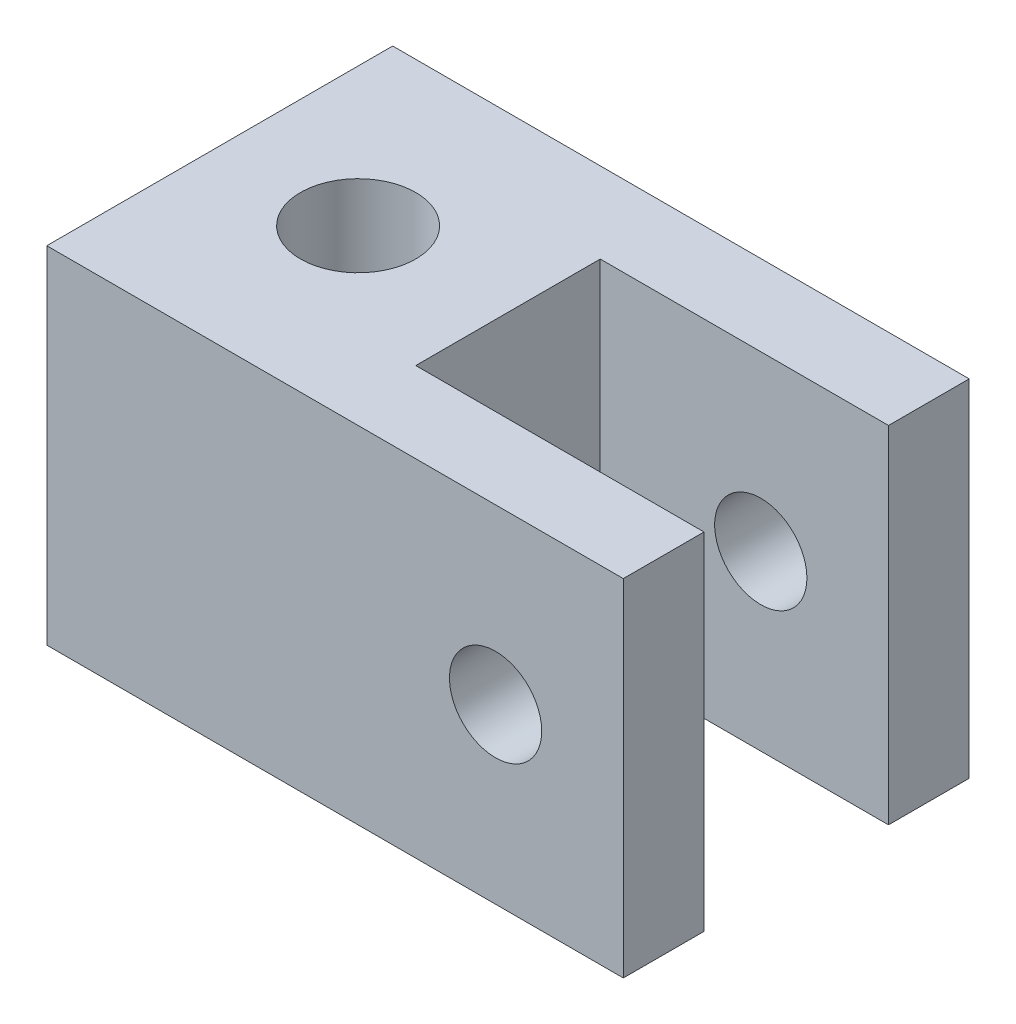
ISO-10303-21;
HEADER;
FILE_DESCRIPTION(('STEP AP214'),'2;1');
FILE_NAME('part.step','',(''),(''),'','','');
FILE_SCHEMA(('AUTOMOTIVE_DESIGN { 1 0 10303 214 1 1 1 1 }'));
ENDSEC;
DATA;
#1=APPLICATION_CONTEXT('core data for automotive mechanical design processes');
#2=APPLICATION_PROTOCOL_DEFINITION('international standard','automotive_design',2000,#1);
#3=PRODUCT_CONTEXT('',#1,'mechanical');
#4=PRODUCT('Part','Part','',(#3));
#5=PRODUCT_RELATED_PRODUCT_CATEGORY('part','',(#4));
#6=PRODUCT_DEFINITION_FORMATION('','',#4);
#7=PRODUCT_DEFINITION_CONTEXT('part definition',#1,'design');
#8=PRODUCT_DEFINITION('design','',#6,#7);
#9=PRODUCT_DEFINITION_SHAPE('','',#8);
#10=(LENGTH_UNIT() NAMED_UNIT(*) SI_UNIT(.MILLI.,.METRE.));
#11=(NAMED_UNIT(*) PLANE_ANGLE_UNIT() SI_UNIT($,.RADIAN.));
#12=(NAMED_UNIT(*) SI_UNIT($,.STERADIAN.) SOLID_ANGLE_UNIT());
#13=UNCERTAINTY_MEASURE_WITH_UNIT(LENGTH_MEASURE(1.E-05),#10,'distance_accuracy_value','');
#14=(GEOMETRIC_REPRESENTATION_CONTEXT(3) GLOBAL_UNCERTAINTY_ASSIGNED_CONTEXT((#13)) GLOBAL_UNIT_ASSIGNED_CONTEXT((#10,
#11,#12)) REPRESENTATION_CONTEXT('',''));
#15=CARTESIAN_POINT('',(0.,0.,0.));
#16=DIRECTION('',(0.,0.,1.));
#17=DIRECTION('',(1.,0.,0.));
#18=AXIS2_PLACEMENT_3D('',#15,#16,#17);
#19=CARTESIAN_POINT('',(12.5,0.,0.));
#20=DIRECTION('',(1.,0.,0.));
#21=DIRECTION('',(0.,0.,-1.));
#22=AXIS2_PLACEMENT_3D('',#19,#20,#21);
#23=PLANE('',#22);
#24=DIRECTION('',(0.,-1.,0.));
#25=VECTOR('',#24,1.);
#26=CARTESIAN_POINT('',(12.5,0.,4.));
#27=LINE('',#26,#25);
#28=CARTESIAN_POINT('',(12.5,7.5,4.));
#29=VERTEX_POINT('',#28);
#30=CARTESIAN_POINT('',(12.5,-7.50000000000001,4.));
#31=VERTEX_POINT('',#30);
#32=EDGE_CURVE('E11',#29,#31,#27,.T.);
#33=ORIENTED_EDGE('',*,*,#32,.F.);
#34=DIRECTION('',(0.,0.,1.));
#35=VECTOR('',#34,1.);
#36=CARTESIAN_POINT('',(12.5,7.5,-7.5));
#37=LINE('',#36,#35);
#38=CARTESIAN_POINT('',(12.5,7.5,7.5));
#39=VERTEX_POINT('',#38);
#40=EDGE_CURVE('E58',#29,#39,#37,.T.);
#41=ORIENTED_EDGE('',*,*,#40,.T.);
#42=DIRECTION('',(0.,-1.,0.));
#43=VECTOR('',#42,1.);
#44=CARTESIAN_POINT('',(12.5,-7.5,7.5));
#45=LINE('',#44,#43);
#46=CARTESIAN_POINT('',(12.5,-7.5,7.5));
#47=VERTEX_POINT('',#46);
#48=EDGE_CURVE('E147',#39,#47,#45,.T.);
#49=ORIENTED_EDGE('',*,*,#48,.T.);
#50=DIRECTION('',(0.,0.,-1.));
#51=VECTOR('',#50,1.);
#52=CARTESIAN_POINT('',(12.5,-7.5,-7.5));
#53=LINE('',#52,#51);
#54=EDGE_CURVE('E88',#47,#31,#53,.T.);
#55=ORIENTED_EDGE('',*,*,#54,.T.);
#56=EDGE_LOOP('',(#33,#41,#49,#55));
#57=FACE_BOUND('',#56,.T.);
#58=ADVANCED_FACE('F33',(#57),#23,.T.);
#59=CARTESIAN_POINT('',(12.5,-7.5,7.5));
#60=DIRECTION('',(0.,0.,-1.));
#61=DIRECTION('',(0.,1.,0.));
#62=AXIS2_PLACEMENT_3D('',#59,#60,#61);
#63=PLANE('',#62);
#64=CARTESIAN_POINT('',(6.96154908193102,0.,7.5));
#65=DIRECTION('',(0.,0.,1.));
#66=DIRECTION('',(1.,0.,0.));
#67=AXIS2_PLACEMENT_3D('',#64,#65,#66);
#68=CIRCLE('',#67,2.);
#69=CARTESIAN_POINT('',(8.96154908193102,0.,7.5));
#70=VERTEX_POINT('',#69);
#71=EDGE_CURVE('E241',#70,#70,#68,.T.);
#72=ORIENTED_EDGE('',*,*,#71,.F.);
#73=EDGE_LOOP('',(#72));
#74=FACE_BOUND('',#73,.T.);
#75=DIRECTION('',(0.,-1.,0.));
#76=VECTOR('',#75,1.);
#77=CARTESIAN_POINT('',(-12.5,-7.5,7.5));
#78=LINE('',#77,#76);
#79=CARTESIAN_POINT('',(-12.5,7.5,7.5));
#80=VERTEX_POINT('',#79);
#81=CARTESIAN_POINT('',(-12.5,-7.5,7.5));
#82=VERTEX_POINT('',#81);
#83=EDGE_CURVE('E144',#80,#82,#78,.T.);
#84=ORIENTED_EDGE('',*,*,#83,.T.);
#85=DIRECTION('',(-1.,0.,0.));
#86=VECTOR('',#85,1.);
#87=CARTESIAN_POINT('',(12.5,-7.5,7.5));
#88=LINE('',#87,#86);
#89=EDGE_CURVE('E169',#47,#82,#88,.T.);
#90=ORIENTED_EDGE('',*,*,#89,.F.);
#91=ORIENTED_EDGE('',*,*,#48,.F.);
#92=DIRECTION('',(-1.,0.,0.));
#93=VECTOR('',#92,1.);
#94=CARTESIAN_POINT('',(12.5,7.5,7.5));
#95=LINE('',#94,#93);
#96=EDGE_CURVE('E155',#39,#80,#95,.T.);
#97=ORIENTED_EDGE('',*,*,#96,.T.);
#98=EDGE_LOOP('',(#84,#90,#91,#97));
#99=FACE_BOUND('',#98,.T.);
#100=ADVANCED_FACE('F35',(#74,#99),#63,.F.);
#101=CARTESIAN_POINT('',(12.5,-7.5,-7.5));
#102=DIRECTION('',(0.,1.,0.));
#103=DIRECTION('',(0.,0.,1.));
#104=AXIS2_PLACEMENT_3D('',#101,#102,#103);
#105=PLANE('',#104);
#106=CARTESIAN_POINT('',(-6.5,-7.50000000000001,0.));
#107=DIRECTION('',(0.,1.,0.));
#108=DIRECTION('',(0.,0.,1.));
#109=AXIS2_PLACEMENT_3D('',#106,#107,#108);
#110=CIRCLE('',#109,2.5);
#111=CARTESIAN_POINT('',(-6.5,-7.50000000000001,2.5));
#112=VERTEX_POINT('',#111);
#113=EDGE_CURVE('E141',#112,#112,#110,.T.);
#114=ORIENTED_EDGE('',*,*,#113,.T.);
#115=EDGE_LOOP('',(#114));
#116=FACE_BOUND('',#115,.T.);
#117=DIRECTION('',(0.,0.,1.));
#118=VECTOR('',#117,1.);
#119=CARTESIAN_POINT('',(0.,-7.50000000000001,4.));
#120=LINE('',#119,#118);
#121=CARTESIAN_POINT('',(0.,-7.50000000000001,-4.));
#122=VERTEX_POINT('',#121);
#123=CARTESIAN_POINT('',(0.,-7.50000000000001,4.));
#124=VERTEX_POINT('',#123);
#125=EDGE_CURVE('E120',#122,#124,#120,.T.);
#126=ORIENTED_EDGE('',*,*,#125,.T.);
#127=DIRECTION('',(1.,0.,0.));
#128=VECTOR('',#127,1.);
#129=CARTESIAN_POINT('',(0.,-7.50000000000001,4.));
#130=LINE('',#129,#128);
#131=EDGE_CURVE('E117',#124,#31,#130,.T.);
#132=ORIENTED_EDGE('',*,*,#131,.T.);
#133=ORIENTED_EDGE('',*,*,#54,.F.);
#134=ORIENTED_EDGE('',*,*,#89,.T.);
#135=DIRECTION('',(0.,0.,-1.));
#136=VECTOR('',#135,1.);
#137=CARTESIAN_POINT('',(-12.5,-7.5,-7.5));
#138=LINE('',#137,#136);
#139=CARTESIAN_POINT('',(-12.5,-7.5,-7.5));
#140=VERTEX_POINT('',#139);
#141=EDGE_CURVE('E158',#82,#140,#138,.T.);
#142=ORIENTED_EDGE('',*,*,#141,.T.);
#143=DIRECTION('',(-1.,0.,0.));
#144=VECTOR('',#143,1.);
#145=CARTESIAN_POINT('',(12.5,-7.5,-7.5));
#146=LINE('',#145,#144);
#147=CARTESIAN_POINT('',(12.5,-7.5,-7.5));
#148=VERTEX_POINT('',#147);
#149=EDGE_CURVE('E166',#148,#140,#146,.T.);
#150=ORIENTED_EDGE('',*,*,#149,.F.);
#151=CARTESIAN_POINT('',(12.5,-7.5,-4.));
#152=VERTEX_POINT('',#151);
#153=EDGE_CURVE('E127',#152,#148,#53,.T.);
#154=ORIENTED_EDGE('',*,*,#153,.F.);
#155=DIRECTION('',(-1.,0.,0.));
#156=VECTOR('',#155,1.);
#157=CARTESIAN_POINT('',(0.,-7.50000000000001,-4.));
#158=LINE('',#157,#156);
#159=EDGE_CURVE('E49',#152,#122,#158,.T.);
#160=ORIENTED_EDGE('',*,*,#159,.T.);
#161=EDGE_LOOP('',(#126,#132,#133,#134,#142,#150,#154,#160));
#162=FACE_BOUND('',#161,.T.);
#163=ADVANCED_FACE('F125',(#116,#162),#105,.F.);
#164=CARTESIAN_POINT('',(12.5,-7.5,-7.5));
#165=DIRECTION('',(0.,0.,1.));
#166=DIRECTION('',(0.,-1.,0.));
#167=AXIS2_PLACEMENT_3D('',#164,#165,#166);
#168=PLANE('',#167);
#169=CARTESIAN_POINT('',(6.96154908193102,0.,-7.5));
#170=DIRECTION('',(0.,0.,1.));
#171=DIRECTION('',(1.,0.,0.));
#172=AXIS2_PLACEMENT_3D('',#169,#170,#171);
#173=CIRCLE('',#172,2.);
#174=CARTESIAN_POINT('',(8.96154908193102,0.,-7.5));
#175=VERTEX_POINT('',#174);
#176=EDGE_CURVE('E245',#175,#175,#173,.T.);
#177=ORIENTED_EDGE('',*,*,#176,.T.);
#178=EDGE_LOOP('',(#177));
#179=FACE_BOUND('',#178,.T.);
#180=DIRECTION('',(0.,1.,0.));
#181=VECTOR('',#180,1.);
#182=CARTESIAN_POINT('',(-12.5,-7.5,-7.5));
#183=LINE('',#182,#181);
#184=CARTESIAN_POINT('',(-12.5,7.5,-7.5));
#185=VERTEX_POINT('',#184);
#186=EDGE_CURVE('E160',#140,#185,#183,.T.);
#187=ORIENTED_EDGE('',*,*,#186,.T.);
#188=DIRECTION('',(-1.,0.,0.));
#189=VECTOR('',#188,1.);
#190=CARTESIAN_POINT('',(12.5,7.5,-7.5));
#191=LINE('',#190,#189);
#192=CARTESIAN_POINT('',(12.5,7.5,-7.5));
#193=VERTEX_POINT('',#192);
#194=EDGE_CURVE('E164',#193,#185,#191,.T.);
#195=ORIENTED_EDGE('',*,*,#194,.F.);
#196=DIRECTION('',(0.,1.,0.));
#197=VECTOR('',#196,1.);
#198=CARTESIAN_POINT('',(12.5,-7.5,-7.5));
#199=LINE('',#198,#197);
#200=EDGE_CURVE('E150',#148,#193,#199,.T.);
#201=ORIENTED_EDGE('',*,*,#200,.F.);
#202=ORIENTED_EDGE('',*,*,#149,.T.);
#203=EDGE_LOOP('',(#187,#195,#201,#202));
#204=FACE_BOUND('',#203,.T.);
#205=ADVANCED_FACE('F179',(#179,#204),#168,.F.);
#206=CARTESIAN_POINT('',(12.5,7.5,-7.5));
#207=DIRECTION('',(0.,-1.,0.));
#208=DIRECTION('',(0.,0.,-1.));
#209=AXIS2_PLACEMENT_3D('',#206,#207,#208);
#210=PLANE('',#209);
#211=CARTESIAN_POINT('',(-6.5,7.5,0.));
#212=DIRECTION('',(0.,1.,0.));
#213=DIRECTION('',(0.,0.,1.));
#214=AXIS2_PLACEMENT_3D('',#211,#212,#213);
#215=CIRCLE('',#214,2.5);
#216=CARTESIAN_POINT('',(-6.5,7.5,2.5));
#217=VERTEX_POINT('',#216);
#218=EDGE_CURVE('E139',#217,#217,#215,.T.);
#219=ORIENTED_EDGE('',*,*,#218,.F.);
#220=EDGE_LOOP('',(#219));
#221=FACE_BOUND('',#220,.T.);
#222=ORIENTED_EDGE('',*,*,#40,.F.);
#223=DIRECTION('',(1.,0.,0.));
#224=VECTOR('',#223,1.);
#225=CARTESIAN_POINT('',(0.,7.5,4.));
#226=LINE('',#225,#224);
#227=CARTESIAN_POINT('',(0.,7.5,4.));
#228=VERTEX_POINT('',#227);
#229=EDGE_CURVE('E128',#228,#29,#226,.T.);
#230=ORIENTED_EDGE('',*,*,#229,.F.);
#231=DIRECTION('',(0.,0.,1.));
#232=VECTOR('',#231,1.);
#233=CARTESIAN_POINT('',(0.,7.5,4.));
#234=LINE('',#233,#232);
#235=CARTESIAN_POINT('',(0.,7.5,-4.));
#236=VERTEX_POINT('',#235);
#237=EDGE_CURVE('E130',#236,#228,#234,.T.);
#238=ORIENTED_EDGE('',*,*,#237,.F.);
#239=DIRECTION('',(-1.,0.,0.));
#240=VECTOR('',#239,1.);
#241=CARTESIAN_POINT('',(0.,7.5,-4.));
#242=LINE('',#241,#240);
#243=CARTESIAN_POINT('',(12.5,7.5,-4.));
#244=VERTEX_POINT('',#243);
#245=EDGE_CURVE('E112',#244,#236,#242,.T.);
#246=ORIENTED_EDGE('',*,*,#245,.F.);
#247=EDGE_CURVE('E152',#193,#244,#37,.T.);
#248=ORIENTED_EDGE('',*,*,#247,.F.);
#249=ORIENTED_EDGE('',*,*,#194,.T.);
#250=DIRECTION('',(0.,0.,1.));
#251=VECTOR('',#250,1.);
#252=CARTESIAN_POINT('',(-12.5,7.5,-7.5));
#253=LINE('',#252,#251);
#254=EDGE_CURVE('E80',#185,#80,#253,.T.);
#255=ORIENTED_EDGE('',*,*,#254,.T.);
#256=ORIENTED_EDGE('',*,*,#96,.F.);
#257=EDGE_LOOP('',(#222,#230,#238,#246,#248,#249,#255,#256));
#258=FACE_BOUND('',#257,.T.);
#259=ADVANCED_FACE('F173',(#221,#258),#210,.F.);
#260=DIRECTION('',(0.,1.,0.));
#261=VECTOR('',#260,1.);
#262=CARTESIAN_POINT('',(12.5,0.,-4.));
#263=LINE('',#262,#261);
#264=EDGE_CURVE('E42',#152,#244,#263,.T.);
#265=ORIENTED_EDGE('',*,*,#264,.F.);
#266=ORIENTED_EDGE('',*,*,#153,.T.);
#267=ORIENTED_EDGE('',*,*,#200,.T.);
#268=ORIENTED_EDGE('',*,*,#247,.T.);
#269=EDGE_LOOP('',(#265,#266,#267,#268));
#270=FACE_BOUND('',#269,.T.);
#271=ADVANCED_FACE('F175',(#270),#23,.T.);
#272=CARTESIAN_POINT('',(-12.5,0.,0.));
#273=DIRECTION('',(1.,0.,0.));
#274=DIRECTION('',(0.,0.,-1.));
#275=AXIS2_PLACEMENT_3D('',#272,#273,#274);
#276=PLANE('',#275);
#277=ORIENTED_EDGE('',*,*,#83,.F.);
#278=ORIENTED_EDGE('',*,*,#254,.F.);
#279=ORIENTED_EDGE('',*,*,#186,.F.);
#280=ORIENTED_EDGE('',*,*,#141,.F.);
#281=EDGE_LOOP('',(#277,#278,#279,#280));
#282=FACE_BOUND('',#281,.T.);
#283=ADVANCED_FACE('F183',(#282),#276,.F.);
#284=CARTESIAN_POINT('',(-6.5,-7.50000000000001,0.));
#285=DIRECTION('',(0.,1.,0.));
#286=DIRECTION('',(0.,0.,1.));
#287=AXIS2_PLACEMENT_3D('',#284,#285,#286);
#288=CYLINDRICAL_SURFACE('',#287,2.5);
#289=ORIENTED_EDGE('',*,*,#113,.F.);
#290=EDGE_LOOP('',(#289));
#291=FACE_BOUND('',#290,.T.);
#292=ORIENTED_EDGE('',*,*,#218,.T.);
#293=EDGE_LOOP('',(#292));
#294=FACE_BOUND('',#293,.T.);
#295=ADVANCED_FACE('F202',(#291,#294),#288,.F.);
#296=CARTESIAN_POINT('',(0.,-7.50000000000001,4.));
#297=DIRECTION('',(0.,0.,1.));
#298=DIRECTION('',(0.,-1.,0.));
#299=AXIS2_PLACEMENT_3D('',#296,#297,#298);
#300=PLANE('',#299);
#301=CARTESIAN_POINT('',(6.96154908193102,0.,4.));
#302=DIRECTION('',(0.,0.,1.));
#303=DIRECTION('',(0.,-1.,0.));
#304=AXIS2_PLACEMENT_3D('',#301,#302,#303);
#305=CIRCLE('',#304,2.);
#306=CARTESIAN_POINT('',(8.96154908193102,0.,4.));
#307=VERTEX_POINT('',#306);
#308=EDGE_CURVE('E133',#307,#307,#305,.T.);
#309=ORIENTED_EDGE('',*,*,#308,.T.);
#310=EDGE_LOOP('',(#309));
#311=FACE_BOUND('',#310,.T.);
#312=ORIENTED_EDGE('',*,*,#32,.T.);
#313=ORIENTED_EDGE('',*,*,#131,.F.);
#314=DIRECTION('',(0.,1.,0.));
#315=VECTOR('',#314,1.);
#316=CARTESIAN_POINT('',(0.,-7.50000000000001,4.));
#317=LINE('',#316,#315);
#318=EDGE_CURVE('E116',#124,#228,#317,.T.);
#319=ORIENTED_EDGE('',*,*,#318,.T.);
#320=ORIENTED_EDGE('',*,*,#229,.T.);
#321=EDGE_LOOP('',(#312,#313,#319,#320));
#322=FACE_BOUND('',#321,.T.);
#323=ADVANCED_FACE('F188',(#311,#322),#300,.F.);
#324=CARTESIAN_POINT('',(0.,-7.50000000000001,4.));
#325=DIRECTION('',(-1.,0.,0.));
#326=DIRECTION('',(0.,0.,1.));
#327=AXIS2_PLACEMENT_3D('',#324,#325,#326);
#328=PLANE('',#327);
#329=ORIENTED_EDGE('',*,*,#237,.T.);
#330=ORIENTED_EDGE('',*,*,#318,.F.);
#331=ORIENTED_EDGE('',*,*,#125,.F.);
#332=DIRECTION('',(0.,1.,0.));
#333=VECTOR('',#332,1.);
#334=CARTESIAN_POINT('',(0.,-7.50000000000001,-4.));
#335=LINE('',#334,#333);
#336=EDGE_CURVE('E108',#122,#236,#335,.T.);
#337=ORIENTED_EDGE('',*,*,#336,.T.);
#338=EDGE_LOOP('',(#329,#330,#331,#337));
#339=FACE_BOUND('',#338,.T.);
#340=ADVANCED_FACE('F121',(#339),#328,.F.);
#341=CARTESIAN_POINT('',(0.,-7.50000000000001,-4.));
#342=DIRECTION('',(0.,0.,-1.));
#343=DIRECTION('',(0.,1.,0.));
#344=AXIS2_PLACEMENT_3D('',#341,#342,#343);
#345=PLANE('',#344);
#346=CARTESIAN_POINT('',(6.96154908193102,0.,-4.));
#347=DIRECTION('',(0.,0.,-1.));
#348=DIRECTION('',(0.,1.,0.));
#349=AXIS2_PLACEMENT_3D('',#346,#347,#348);
#350=CIRCLE('',#349,2.);
#351=CARTESIAN_POINT('',(8.96154908193102,0.,-4.));
#352=VERTEX_POINT('',#351);
#353=EDGE_CURVE('E37',#352,#352,#350,.T.);
#354=ORIENTED_EDGE('',*,*,#353,.T.);
#355=EDGE_LOOP('',(#354));
#356=FACE_BOUND('',#355,.T.);
#357=ORIENTED_EDGE('',*,*,#264,.T.);
#358=ORIENTED_EDGE('',*,*,#245,.T.);
#359=ORIENTED_EDGE('',*,*,#336,.F.);
#360=ORIENTED_EDGE('',*,*,#159,.F.);
#361=EDGE_LOOP('',(#357,#358,#359,#360));
#362=FACE_BOUND('',#361,.T.);
#363=ADVANCED_FACE('F110',(#356,#362),#345,.F.);
#364=CARTESIAN_POINT('',(6.96154908193102,0.,-7.5));
#365=DIRECTION('',(0.,0.,1.));
#366=DIRECTION('',(1.,0.,0.));
#367=AXIS2_PLACEMENT_3D('',#364,#365,#366);
#368=CYLINDRICAL_SURFACE('',#367,2.);
#369=CARTESIAN_POINT('',(8.96154908193102,0.,-7.5));
#370=CARTESIAN_POINT('',(8.96154908193102,0.,-7.46354166666667));
#371=CARTESIAN_POINT('',(8.96154908193102,0.,-7.42708333333333));
#372=CARTESIAN_POINT('',(8.96154908193102,0.,-7.35416666666667));
#373=CARTESIAN_POINT('',(8.96154908193102,0.,-7.31770833333333));
#374=CARTESIAN_POINT('',(8.96154908193102,0.,-7.24479166666667));
#375=CARTESIAN_POINT('',(8.96154908193102,0.,-7.20833333333333));
#376=CARTESIAN_POINT('',(8.96154908193102,0.,-7.13541666666667));
#377=CARTESIAN_POINT('',(8.96154908193102,0.,-7.09895833333333));
#378=CARTESIAN_POINT('',(8.96154908193102,0.,-7.02604166666667));
#379=CARTESIAN_POINT('',(8.96154908193102,0.,-6.98958333333333));
#380=CARTESIAN_POINT('',(8.96154908193102,0.,-6.91666666666667));
#381=CARTESIAN_POINT('',(8.96154908193102,0.,-6.88020833333333));
#382=CARTESIAN_POINT('',(8.96154908193102,0.,-6.80729166666667));
#383=CARTESIAN_POINT('',(8.96154908193102,0.,-6.77083333333333));
#384=CARTESIAN_POINT('',(8.96154908193102,0.,-6.69791666666667));
#385=CARTESIAN_POINT('',(8.96154908193102,0.,-6.66145833333333));
#386=CARTESIAN_POINT('',(8.96154908193102,0.,-6.58854166666667));
#387=CARTESIAN_POINT('',(8.96154908193102,0.,-6.55208333333333));
#388=CARTESIAN_POINT('',(8.96154908193102,0.,-6.47916666666667));
#389=CARTESIAN_POINT('',(8.96154908193102,0.,-6.44270833333333));
#390=CARTESIAN_POINT('',(8.96154908193102,0.,-6.36979166666667));
#391=CARTESIAN_POINT('',(8.96154908193102,0.,-6.33333333333333));
#392=CARTESIAN_POINT('',(8.96154908193102,0.,-6.26041666666667));
#393=CARTESIAN_POINT('',(8.96154908193102,0.,-6.22395833333333));
#394=CARTESIAN_POINT('',(8.96154908193102,0.,-6.15104166666667));
#395=CARTESIAN_POINT('',(8.96154908193102,0.,-6.11458333333333));
#396=CARTESIAN_POINT('',(8.96154908193102,0.,-6.04166666666667));
#397=CARTESIAN_POINT('',(8.96154908193102,0.,-6.00520833333333));
#398=CARTESIAN_POINT('',(8.96154908193102,0.,-5.93229166666667));
#399=CARTESIAN_POINT('',(8.96154908193102,0.,-5.89583333333333));
#400=CARTESIAN_POINT('',(8.96154908193102,0.,-5.82291666666667));
#401=CARTESIAN_POINT('',(8.96154908193102,0.,-5.78645833333333));
#402=CARTESIAN_POINT('',(8.96154908193102,0.,-5.71354166666667));
#403=CARTESIAN_POINT('',(8.96154908193102,0.,-5.67708333333333));
#404=CARTESIAN_POINT('',(8.96154908193102,0.,-5.60416666666667));
#405=CARTESIAN_POINT('',(8.96154908193102,0.,-5.56770833333333));
#406=CARTESIAN_POINT('',(8.96154908193102,0.,-5.49479166666667));
#407=CARTESIAN_POINT('',(8.96154908193102,0.,-5.45833333333333));
#408=CARTESIAN_POINT('',(8.96154908193102,0.,-5.38541666666667));
#409=CARTESIAN_POINT('',(8.96154908193102,0.,-5.34895833333333));
#410=CARTESIAN_POINT('',(8.96154908193102,0.,-5.27604166666667));
#411=CARTESIAN_POINT('',(8.96154908193102,0.,-5.23958333333333));
#412=CARTESIAN_POINT('',(8.96154908193102,0.,-5.16666666666667));
#413=CARTESIAN_POINT('',(8.96154908193102,0.,-5.13020833333333));
#414=CARTESIAN_POINT('',(8.96154908193102,0.,-5.05729166666667));
#415=CARTESIAN_POINT('',(8.96154908193102,0.,-5.02083333333333));
#416=CARTESIAN_POINT('',(8.96154908193102,0.,-4.94791666666667));
#417=CARTESIAN_POINT('',(8.96154908193102,0.,-4.91145833333333));
#418=CARTESIAN_POINT('',(8.96154908193102,0.,-4.83854166666667));
#419=CARTESIAN_POINT('',(8.96154908193102,0.,-4.80208333333333));
#420=CARTESIAN_POINT('',(8.96154908193102,0.,-4.72916666666667));
#421=CARTESIAN_POINT('',(8.96154908193102,0.,-4.69270833333333));
#422=CARTESIAN_POINT('',(8.96154908193102,0.,-4.61979166666667));
#423=CARTESIAN_POINT('',(8.96154908193102,0.,-4.58333333333333));
#424=CARTESIAN_POINT('',(8.96154908193102,0.,-4.51041666666667));
#425=CARTESIAN_POINT('',(8.96154908193102,0.,-4.47395833333333));
#426=CARTESIAN_POINT('',(8.96154908193102,0.,-4.40104166666667));
#427=CARTESIAN_POINT('',(8.96154908193102,0.,-4.36458333333333));
#428=CARTESIAN_POINT('',(8.96154908193102,0.,-4.29166666666667));
#429=CARTESIAN_POINT('',(8.96154908193102,0.,-4.25520833333333));
#430=CARTESIAN_POINT('',(8.96154908193102,0.,-4.18229166666667));
#431=CARTESIAN_POINT('',(8.96154908193102,0.,-4.14583333333333));
#432=CARTESIAN_POINT('',(8.96154908193102,0.,-4.07291666666667));
#433=CARTESIAN_POINT('',(8.96154908193102,0.,-4.03645833333333));
#434=CARTESIAN_POINT('',(8.96154908193102,0.,-4.));
#435=B_SPLINE_CURVE_WITH_KNOTS('',3,(#369,#370,#371,#372,#373,#374,#375,#376,#377,#378,#379,
#380,#381,#382,#383,#384,#385,#386,#387,#388,#389,#390,#391,#392,#393,#394,#395,#396,#397,#398,
#399,#400,#401,#402,#403,#404,#405,#406,#407,#408,#409,#410,#411,#412,#413,#414,#415,#416,#417,
#418,#419,#420,#421,#422,#423,#424,#425,#426,#427,#428,#429,#430,#431,#432,#433,#434),
.UNSPECIFIED.,.F.,.F.,(4,2,2,2,2,2,2,2,2,2,2,2,2,2,2,2,2,2,2,2,2,2,2,2,2,2,2,2,2,2,2,2,4),(0.,
0.109374999999999,0.218749999999999,0.328124999999999,0.4375,0.546875,0.65625,0.765625,0.875,
0.984374999999999,1.09375,1.203125,1.3125,1.421875,1.53125,1.640625,1.75,1.859375,1.96875,
2.078125,2.1875,2.296875,2.40625,2.515625,2.625,2.734375,2.84375,2.953125,3.0625,3.171875,
3.28125,3.390625,3.5),.UNSPECIFIED.);
#436=EDGE_CURVE('BSEAM227',#175,#352,#435,.T.);
#437=ORIENTED_EDGE('',*,*,#176,.F.);
#438=ORIENTED_EDGE('',*,*,#353,.F.);
#439=ORIENTED_EDGE('',*,*,#436,.T.);
#440=ORIENTED_EDGE('',*,*,#436,.F.);
#441=EDGE_LOOP('',(#437,#439,#438,#440));
#442=FACE_BOUND('',#441,.T.);
#443=ADVANCED_FACE('F227',(#442),#368,.F.);
#444=CARTESIAN_POINT('',(8.96154908193102,0.,7.5));
#445=CARTESIAN_POINT('',(8.96154908193102,0.,7.46354166666667));
#446=CARTESIAN_POINT('',(8.96154908193102,0.,7.42708333333333));
#447=CARTESIAN_POINT('',(8.96154908193102,0.,7.35416666666667));
#448=CARTESIAN_POINT('',(8.96154908193102,0.,7.31770833333333));
#449=CARTESIAN_POINT('',(8.96154908193102,0.,7.24479166666667));
#450=CARTESIAN_POINT('',(8.96154908193102,0.,7.20833333333333));
#451=CARTESIAN_POINT('',(8.96154908193102,0.,7.13541666666667));
#452=CARTESIAN_POINT('',(8.96154908193102,0.,7.09895833333333));
#453=CARTESIAN_POINT('',(8.96154908193102,0.,7.02604166666667));
#454=CARTESIAN_POINT('',(8.96154908193102,0.,6.98958333333333));
#455=CARTESIAN_POINT('',(8.96154908193102,0.,6.91666666666667));
#456=CARTESIAN_POINT('',(8.96154908193102,0.,6.88020833333333));
#457=CARTESIAN_POINT('',(8.96154908193102,0.,6.80729166666667));
#458=CARTESIAN_POINT('',(8.96154908193102,0.,6.77083333333333));
#459=CARTESIAN_POINT('',(8.96154908193102,0.,6.69791666666667));
#460=CARTESIAN_POINT('',(8.96154908193102,0.,6.66145833333333));
#461=CARTESIAN_POINT('',(8.96154908193102,0.,6.58854166666667));
#462=CARTESIAN_POINT('',(8.96154908193102,0.,6.55208333333333));
#463=CARTESIAN_POINT('',(8.96154908193102,0.,6.47916666666667));
#464=CARTESIAN_POINT('',(8.96154908193102,0.,6.44270833333334));
#465=CARTESIAN_POINT('',(8.96154908193102,0.,6.36979166666667));
#466=CARTESIAN_POINT('',(8.96154908193102,0.,6.33333333333334));
#467=CARTESIAN_POINT('',(8.96154908193102,0.,6.26041666666667));
#468=CARTESIAN_POINT('',(8.96154908193102,0.,6.22395833333334));
#469=CARTESIAN_POINT('',(8.96154908193102,0.,6.15104166666667));
#470=CARTESIAN_POINT('',(8.96154908193102,0.,6.11458333333334));
#471=CARTESIAN_POINT('',(8.96154908193102,0.,6.04166666666667));
#472=CARTESIAN_POINT('',(8.96154908193102,0.,6.00520833333334));
#473=CARTESIAN_POINT('',(8.96154908193102,0.,5.93229166666667));
#474=CARTESIAN_POINT('',(8.96154908193102,0.,5.89583333333334));
#475=CARTESIAN_POINT('',(8.96154908193102,0.,5.82291666666667));
#476=CARTESIAN_POINT('',(8.96154908193102,0.,5.78645833333334));
#477=CARTESIAN_POINT('',(8.96154908193102,0.,5.71354166666667));
#478=CARTESIAN_POINT('',(8.96154908193102,0.,5.67708333333333));
#479=CARTESIAN_POINT('',(8.96154908193102,0.,5.60416666666667));
#480=CARTESIAN_POINT('',(8.96154908193102,0.,5.56770833333333));
#481=CARTESIAN_POINT('',(8.96154908193102,0.,5.49479166666667));
#482=CARTESIAN_POINT('',(8.96154908193102,0.,5.45833333333333));
#483=CARTESIAN_POINT('',(8.96154908193102,0.,5.38541666666667));
#484=CARTESIAN_POINT('',(8.96154908193102,0.,5.34895833333333));
#485=CARTESIAN_POINT('',(8.96154908193102,0.,5.27604166666667));
#486=CARTESIAN_POINT('',(8.96154908193102,0.,5.23958333333333));
#487=CARTESIAN_POINT('',(8.96154908193102,0.,5.16666666666667));
#488=CARTESIAN_POINT('',(8.96154908193102,0.,5.13020833333334));
#489=CARTESIAN_POINT('',(8.96154908193102,0.,5.05729166666667));
#490=CARTESIAN_POINT('',(8.96154908193102,0.,5.02083333333333));
#491=CARTESIAN_POINT('',(8.96154908193102,0.,4.94791666666667));
#492=CARTESIAN_POINT('',(8.96154908193102,0.,4.91145833333334));
#493=CARTESIAN_POINT('',(8.96154908193102,0.,4.83854166666667));
#494=CARTESIAN_POINT('',(8.96154908193102,0.,4.80208333333333));
#495=CARTESIAN_POINT('',(8.96154908193102,0.,4.72916666666667));
#496=CARTESIAN_POINT('',(8.96154908193102,0.,4.69270833333333));
#497=CARTESIAN_POINT('',(8.96154908193102,0.,4.61979166666667));
#498=CARTESIAN_POINT('',(8.96154908193102,0.,4.58333333333334));
#499=CARTESIAN_POINT('',(8.96154908193102,0.,4.51041666666667));
#500=CARTESIAN_POINT('',(8.96154908193102,0.,4.47395833333334));
#501=CARTESIAN_POINT('',(8.96154908193102,0.,4.40104166666667));
#502=CARTESIAN_POINT('',(8.96154908193102,0.,4.36458333333334));
#503=CARTESIAN_POINT('',(8.96154908193102,0.,4.29166666666667));
#504=CARTESIAN_POINT('',(8.96154908193102,0.,4.25520833333334));
#505=CARTESIAN_POINT('',(8.96154908193102,0.,4.18229166666667));
#506=CARTESIAN_POINT('',(8.96154908193102,0.,4.14583333333334));
#507=CARTESIAN_POINT('',(8.96154908193102,0.,4.07291666666667));
#508=CARTESIAN_POINT('',(8.96154908193102,0.,4.03645833333334));
#509=CARTESIAN_POINT('',(8.96154908193102,0.,4.));
#510=B_SPLINE_CURVE_WITH_KNOTS('',3,(#444,#445,#446,#447,#448,#449,#450,#451,#452,#453,#454,
#455,#456,#457,#458,#459,#460,#461,#462,#463,#464,#465,#466,#467,#468,#469,#470,#471,#472,#473,
#474,#475,#476,#477,#478,#479,#480,#481,#482,#483,#484,#485,#486,#487,#488,#489,#490,#491,#492,
#493,#494,#495,#496,#497,#498,#499,#500,#501,#502,#503,#504,#505,#506,#507,#508,#509),
.UNSPECIFIED.,.F.,.F.,(4,2,2,2,2,2,2,2,2,2,2,2,2,2,2,2,2,2,2,2,2,2,2,2,2,2,2,2,2,2,2,2,4),(0.,
0.109375,0.21875,0.328125,0.4375,0.546875,0.656250000000001,0.765625000000001,0.875000000000001,
0.984374999999999,1.09375,1.203125,1.3125,1.421875,1.53125,1.640625,1.75,1.859375,1.96875,
2.078125,2.1875,2.296875,2.40625,2.515625,2.625,2.734375,2.84375,2.953125,3.0625,3.171875,
3.28125,3.390625,3.5),.UNSPECIFIED.);
#511=EDGE_CURVE('BSEAM231',#70,#307,#510,.T.);
#512=ORIENTED_EDGE('',*,*,#71,.T.);
#513=ORIENTED_EDGE('',*,*,#308,.F.);
#514=ORIENTED_EDGE('',*,*,#511,.T.);
#515=ORIENTED_EDGE('',*,*,#511,.F.);
#516=EDGE_LOOP('',(#512,#514,#513,#515));
#517=FACE_BOUND('',#516,.T.);
#518=ADVANCED_FACE('F231',(#517),#368,.F.);
#519=CLOSED_SHELL('',(#58,#100,#163,#205,#259,#271,#283,#295,#323,#340,#363,#443,#518));
#520=MANIFOLD_SOLID_BREP('B2',#519);
#521=ADVANCED_BREP_SHAPE_REPRESENTATION('',(#18,#520),#14);
#522=SHAPE_DEFINITION_REPRESENTATION(#9,#521);
ENDSEC;
END-ISO-10303-21;
